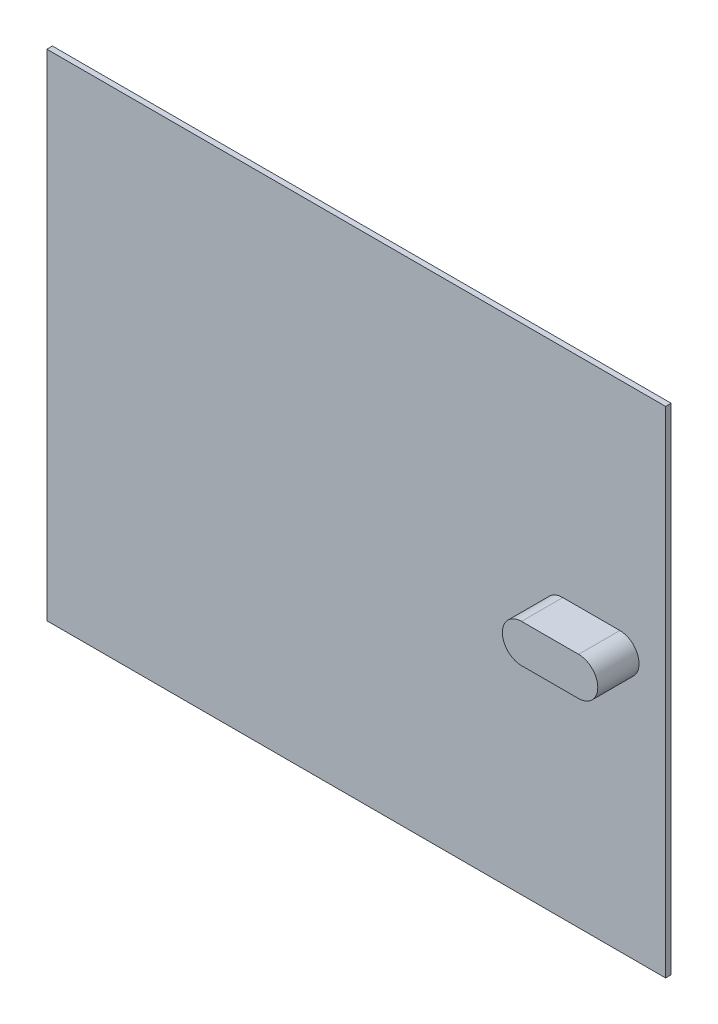
ISO-10303-21;
HEADER;
FILE_DESCRIPTION(('STEP AP214'),'2;1');
FILE_NAME('part.step','',(''),(''),'','','');
FILE_SCHEMA(('AUTOMOTIVE_DESIGN { 1 0 10303 214 1 1 1 1 }'));
ENDSEC;
DATA;
#1=APPLICATION_CONTEXT('core data for automotive mechanical design processes');
#2=APPLICATION_PROTOCOL_DEFINITION('international standard','automotive_design',2000,#1);
#3=PRODUCT_CONTEXT('',#1,'mechanical');
#4=PRODUCT('Part','Part','',(#3));
#5=PRODUCT_RELATED_PRODUCT_CATEGORY('part','',(#4));
#6=PRODUCT_DEFINITION_FORMATION('','',#4);
#7=PRODUCT_DEFINITION_CONTEXT('part definition',#1,'design');
#8=PRODUCT_DEFINITION('design','',#6,#7);
#9=PRODUCT_DEFINITION_SHAPE('','',#8);
#10=(LENGTH_UNIT() NAMED_UNIT(*) SI_UNIT(.MILLI.,.METRE.));
#11=(NAMED_UNIT(*) PLANE_ANGLE_UNIT() SI_UNIT($,.RADIAN.));
#12=(NAMED_UNIT(*) SI_UNIT($,.STERADIAN.) SOLID_ANGLE_UNIT());
#13=UNCERTAINTY_MEASURE_WITH_UNIT(LENGTH_MEASURE(1.E-05),#10,'distance_accuracy_value','');
#14=(GEOMETRIC_REPRESENTATION_CONTEXT(3) GLOBAL_UNCERTAINTY_ASSIGNED_CONTEXT((#13)) GLOBAL_UNIT_ASSIGNED_CONTEXT((#10,
#11,#12)) REPRESENTATION_CONTEXT('',''));
#15=CARTESIAN_POINT('',(0.,0.,0.));
#16=DIRECTION('',(0.,0.,1.));
#17=DIRECTION('',(1.,0.,0.));
#18=AXIS2_PLACEMENT_3D('',#15,#16,#17);
#19=CARTESIAN_POINT('',(136.763125,-94.13875,2.00000000000066));
#20=DIRECTION('',(0.,0.,1.));
#21=DIRECTION('',(1.,0.,0.));
#22=AXIS2_PLACEMENT_3D('',#19,#20,#21);
#23=PLANE('',#22);
#24=DIRECTION('',(0.,1.,0.));
#25=VECTOR('',#24,1.);
#26=CARTESIAN_POINT('',(136.763125,-94.13875,2.00000000000066));
#27=LINE('',#26,#25);
#28=CARTESIAN_POINT('',(136.763125,-94.13875,2.00000000000066));
#29=VERTEX_POINT('',#28);
#30=CARTESIAN_POINT('',(136.763125,85.8612499999999,2.00000000000066));
#31=VERTEX_POINT('',#30);
#32=EDGE_CURVE('E148',#29,#31,#27,.T.);
#33=ORIENTED_EDGE('',*,*,#32,.T.);
#34=DIRECTION('',(-1.,0.,0.));
#35=VECTOR('',#34,1.);
#36=CARTESIAN_POINT('',(136.763125,85.8612499999999,2.00000000000066));
#37=LINE('',#36,#35);
#38=CARTESIAN_POINT('',(-88.236875,85.8612499999999,2.00000000000066));
#39=VERTEX_POINT('',#38);
#40=EDGE_CURVE('E93',#31,#39,#37,.T.);
#41=ORIENTED_EDGE('',*,*,#40,.T.);
#42=DIRECTION('',(0.,-1.,0.));
#43=VECTOR('',#42,1.);
#44=CARTESIAN_POINT('',(-88.236875,-94.13875,2.00000000000066));
#45=LINE('',#44,#43);
#46=CARTESIAN_POINT('',(-88.236875,-94.13875,2.00000000000066));
#47=VERTEX_POINT('',#46);
#48=EDGE_CURVE('E151',#39,#47,#45,.T.);
#49=ORIENTED_EDGE('',*,*,#48,.T.);
#50=DIRECTION('',(1.,0.,0.));
#51=VECTOR('',#50,1.);
#52=CARTESIAN_POINT('',(136.763125,-94.13875,2.00000000000066));
#53=LINE('',#52,#51);
#54=EDGE_CURVE('E65',#47,#29,#53,.T.);
#55=ORIENTED_EDGE('',*,*,#54,.T.);
#56=EDGE_LOOP('',(#33,#41,#49,#55));
#57=FACE_BOUND('',#56,.T.);
#58=DIRECTION('',(1.,0.,0.));
#59=VECTOR('',#58,1.);
#60=CARTESIAN_POINT('',(99.3619019238232,-6.97004767976935,2.00000000000066));
#61=LINE('',#60,#59);
#62=CARTESIAN_POINT('',(99.3619019238232,-6.97004767976935,2.00000000000066));
#63=VERTEX_POINT('',#62);
#64=CARTESIAN_POINT('',(120.117155014692,-6.97004767976935,2.00000000000066));
#65=VERTEX_POINT('',#64);
#66=EDGE_CURVE('E293',#63,#65,#61,.T.);
#67=ORIENTED_EDGE('',*,*,#66,.F.);
#68=CARTESIAN_POINT('',(99.3619019238232,0.,2.00000000000066));
#69=DIRECTION('',(0.,0.,1.));
#70=DIRECTION('',(1.,0.,0.));
#71=AXIS2_PLACEMENT_3D('',#68,#69,#70);
#72=CIRCLE('',#71,6.97004767976935);
#73=CARTESIAN_POINT('',(99.3619019238232,6.97004767976935,2.00000000000066));
#74=VERTEX_POINT('',#73);
#75=EDGE_CURVE('E138',#74,#63,#72,.T.);
#76=ORIENTED_EDGE('',*,*,#75,.F.);
#77=DIRECTION('',(-1.,0.,0.));
#78=VECTOR('',#77,1.);
#79=CARTESIAN_POINT('',(99.3619019238232,6.97004767976935,2.00000000000066));
#80=LINE('',#79,#78);
#81=CARTESIAN_POINT('',(120.117155014692,6.97004767976934,2.00000000000066));
#82=VERTEX_POINT('',#81);
#83=EDGE_CURVE('E134',#82,#74,#80,.T.);
#84=ORIENTED_EDGE('',*,*,#83,.F.);
#85=CARTESIAN_POINT('',(120.117155014692,0.,2.00000000000066));
#86=DIRECTION('',(0.,0.,1.));
#87=DIRECTION('',(1.,0.,0.));
#88=AXIS2_PLACEMENT_3D('',#85,#86,#87);
#89=CIRCLE('',#88,6.97004767976935);
#90=EDGE_CURVE('E290',#65,#82,#89,.T.);
#91=ORIENTED_EDGE('',*,*,#90,.F.);
#92=EDGE_LOOP('',(#67,#76,#84,#91));
#93=FACE_BOUND('',#92,.T.);
#94=ADVANCED_FACE('F41',(#57,#93),#23,.T.);
#95=CARTESIAN_POINT('',(136.763125,-94.13875,2.00000000000066));
#96=DIRECTION('',(-1.,0.,0.));
#97=DIRECTION('',(0.,0.,1.));
#98=AXIS2_PLACEMENT_3D('',#95,#96,#97);
#99=PLANE('',#98);
#100=DIRECTION('',(0.,1.,0.));
#101=VECTOR('',#100,1.);
#102=CARTESIAN_POINT('',(136.763125,-94.13875,6.57367377774038E-13));
#103=LINE('',#102,#101);
#104=CARTESIAN_POINT('',(136.763125,-94.13875,6.57367377774038E-13));
#105=VERTEX_POINT('',#104);
#106=CARTESIAN_POINT('',(136.763125,85.8612499999999,6.57367377774038E-13));
#107=VERTEX_POINT('',#106);
#108=EDGE_CURVE('E140',#105,#107,#103,.T.);
#109=ORIENTED_EDGE('',*,*,#108,.T.);
#110=DIRECTION('',(0.,0.,-1.));
#111=VECTOR('',#110,1.);
#112=CARTESIAN_POINT('',(136.763125,85.8612499999999,2.00000000000066));
#113=LINE('',#112,#111);
#114=EDGE_CURVE('E11',#31,#107,#113,.T.);
#115=ORIENTED_EDGE('',*,*,#114,.F.);
#116=ORIENTED_EDGE('',*,*,#32,.F.);
#117=DIRECTION('',(0.,0.,-1.));
#118=VECTOR('',#117,1.);
#119=CARTESIAN_POINT('',(136.763125,-94.13875,2.00000000000066));
#120=LINE('',#119,#118);
#121=EDGE_CURVE('E153',#29,#105,#120,.T.);
#122=ORIENTED_EDGE('',*,*,#121,.T.);
#123=EDGE_LOOP('',(#109,#115,#116,#122));
#124=FACE_BOUND('',#123,.T.);
#125=ADVANCED_FACE('F43',(#124),#99,.F.);
#126=CARTESIAN_POINT('',(136.763125,85.8612499999999,2.00000000000066));
#127=DIRECTION('',(0.,-1.,0.));
#128=DIRECTION('',(0.,0.,-1.));
#129=AXIS2_PLACEMENT_3D('',#126,#127,#128);
#130=PLANE('',#129);
#131=DIRECTION('',(-1.,0.,0.));
#132=VECTOR('',#131,1.);
#133=CARTESIAN_POINT('',(136.763125,85.8612499999999,6.57367377774038E-13));
#134=LINE('',#133,#132);
#135=CARTESIAN_POINT('',(-88.236875,85.8612499999999,6.57367377774038E-13));
#136=VERTEX_POINT('',#135);
#137=EDGE_CURVE('E143',#107,#136,#134,.T.);
#138=ORIENTED_EDGE('',*,*,#137,.T.);
#139=DIRECTION('',(0.,0.,-1.));
#140=VECTOR('',#139,1.);
#141=CARTESIAN_POINT('',(-88.236875,85.8612499999999,2.00000000000066));
#142=LINE('',#141,#140);
#143=EDGE_CURVE('E49',#39,#136,#142,.T.);
#144=ORIENTED_EDGE('',*,*,#143,.F.);
#145=ORIENTED_EDGE('',*,*,#40,.F.);
#146=ORIENTED_EDGE('',*,*,#114,.T.);
#147=EDGE_LOOP('',(#138,#144,#145,#146));
#148=FACE_BOUND('',#147,.T.);
#149=ADVANCED_FACE('F181',(#148),#130,.F.);
#150=CARTESIAN_POINT('',(-88.236875,-94.13875,2.00000000000066));
#151=DIRECTION('',(1.,0.,0.));
#152=DIRECTION('',(0.,0.,-1.));
#153=AXIS2_PLACEMENT_3D('',#150,#151,#152);
#154=PLANE('',#153);
#155=DIRECTION('',(0.,-1.,0.));
#156=VECTOR('',#155,1.);
#157=CARTESIAN_POINT('',(-88.236875,-94.13875,6.57367377774038E-13));
#158=LINE('',#157,#156);
#159=CARTESIAN_POINT('',(-88.236875,-94.13875,6.57367377774038E-13));
#160=VERTEX_POINT('',#159);
#161=EDGE_CURVE('E156',#136,#160,#158,.T.);
#162=ORIENTED_EDGE('',*,*,#161,.T.);
#163=DIRECTION('',(0.,0.,-1.));
#164=VECTOR('',#163,1.);
#165=CARTESIAN_POINT('',(-88.236875,-94.13875,2.00000000000066));
#166=LINE('',#165,#164);
#167=EDGE_CURVE('E160',#47,#160,#166,.T.);
#168=ORIENTED_EDGE('',*,*,#167,.F.);
#169=ORIENTED_EDGE('',*,*,#48,.F.);
#170=ORIENTED_EDGE('',*,*,#143,.T.);
#171=EDGE_LOOP('',(#162,#168,#169,#170));
#172=FACE_BOUND('',#171,.T.);
#173=ADVANCED_FACE('F165',(#172),#154,.F.);
#174=CARTESIAN_POINT('',(136.763125,-94.13875,2.00000000000066));
#175=DIRECTION('',(0.,1.,0.));
#176=DIRECTION('',(0.,0.,1.));
#177=AXIS2_PLACEMENT_3D('',#174,#175,#176);
#178=PLANE('',#177);
#179=DIRECTION('',(1.,0.,0.));
#180=VECTOR('',#179,1.);
#181=CARTESIAN_POINT('',(136.763125,-94.13875,6.57367377774038E-13));
#182=LINE('',#181,#180);
#183=EDGE_CURVE('E86',#160,#105,#182,.T.);
#184=ORIENTED_EDGE('',*,*,#183,.T.);
#185=ORIENTED_EDGE('',*,*,#121,.F.);
#186=ORIENTED_EDGE('',*,*,#54,.F.);
#187=ORIENTED_EDGE('',*,*,#167,.T.);
#188=EDGE_LOOP('',(#184,#185,#186,#187));
#189=FACE_BOUND('',#188,.T.);
#190=ADVANCED_FACE('F173',(#189),#178,.F.);
#191=CARTESIAN_POINT('',(136.763125,-94.13875,6.57367377774038E-13));
#192=DIRECTION('',(0.,0.,1.));
#193=DIRECTION('',(1.,0.,0.));
#194=AXIS2_PLACEMENT_3D('',#191,#192,#193);
#195=PLANE('',#194);
#196=ORIENTED_EDGE('',*,*,#108,.F.);
#197=ORIENTED_EDGE('',*,*,#183,.F.);
#198=ORIENTED_EDGE('',*,*,#161,.F.);
#199=ORIENTED_EDGE('',*,*,#137,.F.);
#200=EDGE_LOOP('',(#196,#197,#198,#199));
#201=FACE_BOUND('',#200,.T.);
#202=ADVANCED_FACE('F169',(#201),#195,.F.);
#203=CARTESIAN_POINT('',(99.3619019238232,0.,17.0000000000007));
#204=DIRECTION('',(0.,0.,-1.));
#205=DIRECTION('',(-1.,0.,0.));
#206=AXIS2_PLACEMENT_3D('',#203,#204,#205);
#207=CYLINDRICAL_SURFACE('',#206,6.97004767976935);
#208=ORIENTED_EDGE('',*,*,#75,.T.);
#209=DIRECTION('',(0.,0.,-1.));
#210=VECTOR('',#209,1.);
#211=CARTESIAN_POINT('',(99.3619019238232,-6.97004767976935,17.0000000000007));
#212=LINE('',#211,#210);
#213=CARTESIAN_POINT('',(99.3619019238232,-6.97004767976935,17.0000000000007));
#214=VERTEX_POINT('',#213);
#215=EDGE_CURVE('E119',#214,#63,#212,.T.);
#216=ORIENTED_EDGE('',*,*,#215,.F.);
#217=CARTESIAN_POINT('',(99.3619019238232,0.,17.0000000000007));
#218=DIRECTION('',(0.,0.,1.));
#219=DIRECTION('',(1.,0.,0.));
#220=AXIS2_PLACEMENT_3D('',#217,#218,#219);
#221=CIRCLE('',#220,6.97004767976935);
#222=CARTESIAN_POINT('',(99.3619019238232,6.97004767976935,17.0000000000007));
#223=VERTEX_POINT('',#222);
#224=EDGE_CURVE('E126',#223,#214,#221,.T.);
#225=ORIENTED_EDGE('',*,*,#224,.F.);
#226=DIRECTION('',(0.,0.,-1.));
#227=VECTOR('',#226,1.);
#228=CARTESIAN_POINT('',(99.3619019238232,6.97004767976935,17.0000000000007));
#229=LINE('',#228,#227);
#230=EDGE_CURVE('E288',#223,#74,#229,.T.);
#231=ORIENTED_EDGE('',*,*,#230,.T.);
#232=EDGE_LOOP('',(#208,#216,#225,#231));
#233=FACE_BOUND('',#232,.T.);
#234=ADVANCED_FACE('F136',(#233),#207,.T.);
#235=CARTESIAN_POINT('',(99.3619019238232,-6.97004767976935,17.0000000000007));
#236=DIRECTION('',(0.,1.,0.));
#237=DIRECTION('',(0.,0.,1.));
#238=AXIS2_PLACEMENT_3D('',#235,#236,#237);
#239=PLANE('',#238);
#240=ORIENTED_EDGE('',*,*,#66,.T.);
#241=DIRECTION('',(0.,0.,-1.));
#242=VECTOR('',#241,1.);
#243=CARTESIAN_POINT('',(120.117155014692,-6.97004767976935,17.0000000000007));
#244=LINE('',#243,#242);
#245=CARTESIAN_POINT('',(120.117155014692,-6.97004767976935,17.0000000000007));
#246=VERTEX_POINT('',#245);
#247=EDGE_CURVE('E122',#246,#65,#244,.T.);
#248=ORIENTED_EDGE('',*,*,#247,.F.);
#249=DIRECTION('',(1.,0.,0.));
#250=VECTOR('',#249,1.);
#251=CARTESIAN_POINT('',(99.3619019238232,-6.97004767976935,17.0000000000007));
#252=LINE('',#251,#250);
#253=EDGE_CURVE('E115',#214,#246,#252,.T.);
#254=ORIENTED_EDGE('',*,*,#253,.F.);
#255=ORIENTED_EDGE('',*,*,#215,.T.);
#256=EDGE_LOOP('',(#240,#248,#254,#255));
#257=FACE_BOUND('',#256,.T.);
#258=ADVANCED_FACE('F117',(#257),#239,.F.);
#259=CARTESIAN_POINT('',(120.117155014692,0.,17.0000000000007));
#260=DIRECTION('',(0.,0.,-1.));
#261=DIRECTION('',(-1.,0.,0.));
#262=AXIS2_PLACEMENT_3D('',#259,#260,#261);
#263=CYLINDRICAL_SURFACE('',#262,6.97004767976935);
#264=ORIENTED_EDGE('',*,*,#90,.T.);
#265=DIRECTION('',(0.,0.,-1.));
#266=VECTOR('',#265,1.);
#267=CARTESIAN_POINT('',(120.117155014692,6.97004767976935,17.0000000000007));
#268=LINE('',#267,#266);
#269=CARTESIAN_POINT('',(120.117155014692,6.97004767976935,17.0000000000007));
#270=VERTEX_POINT('',#269);
#271=EDGE_CURVE('E56',#270,#82,#268,.T.);
#272=ORIENTED_EDGE('',*,*,#271,.F.);
#273=CARTESIAN_POINT('',(120.117155014692,0.,17.0000000000007));
#274=DIRECTION('',(0.,0.,1.));
#275=DIRECTION('',(1.,0.,0.));
#276=AXIS2_PLACEMENT_3D('',#273,#274,#275);
#277=CIRCLE('',#276,6.97004767976935);
#278=EDGE_CURVE('E125',#246,#270,#277,.T.);
#279=ORIENTED_EDGE('',*,*,#278,.F.);
#280=ORIENTED_EDGE('',*,*,#247,.T.);
#281=EDGE_LOOP('',(#264,#272,#279,#280));
#282=FACE_BOUND('',#281,.T.);
#283=ADVANCED_FACE('F194',(#282),#263,.T.);
#284=CARTESIAN_POINT('',(99.3619019238232,6.97004767976935,17.0000000000007));
#285=DIRECTION('',(0.,-1.,0.));
#286=DIRECTION('',(0.,0.,-1.));
#287=AXIS2_PLACEMENT_3D('',#284,#285,#286);
#288=PLANE('',#287);
#289=ORIENTED_EDGE('',*,*,#83,.T.);
#290=ORIENTED_EDGE('',*,*,#230,.F.);
#291=DIRECTION('',(-1.,0.,0.));
#292=VECTOR('',#291,1.);
#293=CARTESIAN_POINT('',(99.3619019238232,6.97004767976935,17.0000000000007));
#294=LINE('',#293,#292);
#295=EDGE_CURVE('E130',#270,#223,#294,.T.);
#296=ORIENTED_EDGE('',*,*,#295,.F.);
#297=ORIENTED_EDGE('',*,*,#271,.T.);
#298=EDGE_LOOP('',(#289,#290,#296,#297));
#299=FACE_BOUND('',#298,.T.);
#300=ADVANCED_FACE('F197',(#299),#288,.F.);
#301=CARTESIAN_POINT('',(99.3619019238232,0.,17.0000000000007));
#302=DIRECTION('',(0.,0.,1.));
#303=DIRECTION('',(1.,0.,0.));
#304=AXIS2_PLACEMENT_3D('',#301,#302,#303);
#305=PLANE('',#304);
#306=ORIENTED_EDGE('',*,*,#224,.T.);
#307=ORIENTED_EDGE('',*,*,#253,.T.);
#308=ORIENTED_EDGE('',*,*,#278,.T.);
#309=ORIENTED_EDGE('',*,*,#295,.T.);
#310=EDGE_LOOP('',(#306,#307,#308,#309));
#311=FACE_BOUND('',#310,.T.);
#312=ADVANCED_FACE('F129',(#311),#305,.T.);
#313=CLOSED_SHELL('',(#94,#125,#149,#173,#190,#202,#234,#258,#283,#300,#312));
#314=MANIFOLD_SOLID_BREP('B2',#313);
#315=ADVANCED_BREP_SHAPE_REPRESENTATION('',(#18,#314),#14);
#316=SHAPE_DEFINITION_REPRESENTATION(#9,#315);
ENDSEC;
END-ISO-10303-21;
